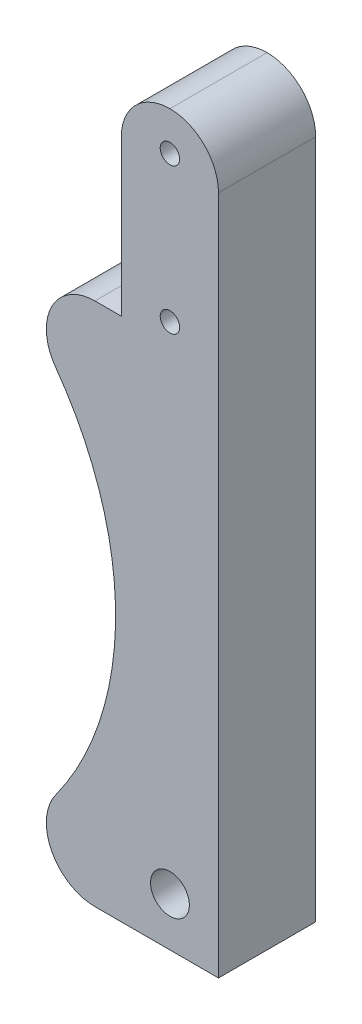
ISO-10303-21;
HEADER;
FILE_DESCRIPTION(('STEP AP214'),'2;1');
FILE_NAME('part.step','',(''),(''),'','','');
FILE_SCHEMA(('AUTOMOTIVE_DESIGN { 1 0 10303 214 1 1 1 1 }'));
ENDSEC;
DATA;
#1=APPLICATION_CONTEXT('core data for automotive mechanical design processes');
#2=APPLICATION_PROTOCOL_DEFINITION('international standard','automotive_design',2000,#1);
#3=PRODUCT_CONTEXT('',#1,'mechanical');
#4=PRODUCT('Part','Part','',(#3));
#5=PRODUCT_RELATED_PRODUCT_CATEGORY('part','',(#4));
#6=PRODUCT_DEFINITION_FORMATION('','',#4);
#7=PRODUCT_DEFINITION_CONTEXT('part definition',#1,'design');
#8=PRODUCT_DEFINITION('design','',#6,#7);
#9=PRODUCT_DEFINITION_SHAPE('','',#8);
#10=(LENGTH_UNIT() NAMED_UNIT(*) SI_UNIT(.MILLI.,.METRE.));
#11=(NAMED_UNIT(*) PLANE_ANGLE_UNIT() SI_UNIT($,.RADIAN.));
#12=(NAMED_UNIT(*) SI_UNIT($,.STERADIAN.) SOLID_ANGLE_UNIT());
#13=UNCERTAINTY_MEASURE_WITH_UNIT(LENGTH_MEASURE(1.E-05),#10,'distance_accuracy_value','');
#14=(GEOMETRIC_REPRESENTATION_CONTEXT(3) GLOBAL_UNCERTAINTY_ASSIGNED_CONTEXT((#13)) GLOBAL_UNIT_ASSIGNED_CONTEXT((#10,
#11,#12)) REPRESENTATION_CONTEXT('',''));
#15=CARTESIAN_POINT('',(0.,0.,0.));
#16=DIRECTION('',(0.,0.,1.));
#17=DIRECTION('',(1.,0.,0.));
#18=AXIS2_PLACEMENT_3D('',#15,#16,#17);
#19=CARTESIAN_POINT('',(0.,0.,10.));
#20=DIRECTION('',(1.,0.,0.));
#21=DIRECTION('',(0.,0.,-1.));
#22=AXIS2_PLACEMENT_3D('',#19,#20,#21);
#23=PLANE('',#22);
#24=DIRECTION('',(0.,-1.,0.));
#25=VECTOR('',#24,1.);
#26=CARTESIAN_POINT('',(0.,0.,0.));
#27=LINE('',#26,#25);
#28=CARTESIAN_POINT('',(0.,70.,0.));
#29=VERTEX_POINT('',#28);
#30=CARTESIAN_POINT('',(0.,54.,0.));
#31=VERTEX_POINT('',#30);
#32=EDGE_CURVE('E129',#29,#31,#27,.T.);
#33=ORIENTED_EDGE('',*,*,#32,.T.);
#34=DIRECTION('',(0.,0.,1.));
#35=VECTOR('',#34,1.);
#36=CARTESIAN_POINT('',(0.,54.,0.));
#37=LINE('',#36,#35);
#38=CARTESIAN_POINT('',(0.,54.,10.));
#39=VERTEX_POINT('',#38);
#40=EDGE_CURVE('E150',#31,#39,#37,.T.);
#41=ORIENTED_EDGE('',*,*,#40,.T.);
#42=DIRECTION('',(0.,-1.,0.));
#43=VECTOR('',#42,1.);
#44=CARTESIAN_POINT('',(0.,0.,10.));
#45=LINE('',#44,#43);
#46=CARTESIAN_POINT('',(0.,70.,10.));
#47=VERTEX_POINT('',#46);
#48=EDGE_CURVE('E111',#47,#39,#45,.T.);
#49=ORIENTED_EDGE('',*,*,#48,.F.);
#50=DIRECTION('',(0.,0.,-1.));
#51=VECTOR('',#50,1.);
#52=CARTESIAN_POINT('',(0.,70.,10.));
#53=LINE('',#52,#51);
#54=EDGE_CURVE('E143',#47,#29,#53,.T.);
#55=ORIENTED_EDGE('',*,*,#54,.T.);
#56=EDGE_LOOP('',(#33,#41,#49,#55));
#57=FACE_BOUND('',#56,.T.);
#58=ADVANCED_FACE('F33',(#57),#23,.F.);
#59=CARTESIAN_POINT('',(0.,0.,10.));
#60=DIRECTION('',(0.,1.,0.));
#61=DIRECTION('',(0.,0.,1.));
#62=AXIS2_PLACEMENT_3D('',#59,#60,#61);
#63=PLANE('',#62);
#64=DIRECTION('',(1.,0.,0.));
#65=VECTOR('',#64,1.);
#66=CARTESIAN_POINT('',(0.,0.,10.));
#67=LINE('',#66,#65);
#68=CARTESIAN_POINT('',(-2.72148323700512,0.,10.));
#69=VERTEX_POINT('',#68);
#70=CARTESIAN_POINT('',(10.,0.,10.));
#71=VERTEX_POINT('',#70);
#72=EDGE_CURVE('E103',#69,#71,#67,.T.);
#73=ORIENTED_EDGE('',*,*,#72,.F.);
#74=DIRECTION('',(0.,0.,-1.));
#75=VECTOR('',#74,1.);
#76=CARTESIAN_POINT('',(-2.72148323700512,0.,0.));
#77=LINE('',#76,#75);
#78=CARTESIAN_POINT('',(-2.72148323700512,0.,0.));
#79=VERTEX_POINT('',#78);
#80=EDGE_CURVE('E11',#69,#79,#77,.T.);
#81=ORIENTED_EDGE('',*,*,#80,.T.);
#82=DIRECTION('',(1.,0.,0.));
#83=VECTOR('',#82,1.);
#84=CARTESIAN_POINT('',(0.,0.,0.));
#85=LINE('',#84,#83);
#86=CARTESIAN_POINT('',(10.,0.,0.));
#87=VERTEX_POINT('',#86);
#88=EDGE_CURVE('E116',#79,#87,#85,.T.);
#89=ORIENTED_EDGE('',*,*,#88,.T.);
#90=DIRECTION('',(0.,0.,-1.));
#91=VECTOR('',#90,1.);
#92=CARTESIAN_POINT('',(10.,0.,10.));
#93=LINE('',#92,#91);
#94=EDGE_CURVE('E114',#71,#87,#93,.T.);
#95=ORIENTED_EDGE('',*,*,#94,.F.);
#96=EDGE_LOOP('',(#73,#81,#89,#95));
#97=FACE_BOUND('',#96,.T.);
#98=ADVANCED_FACE('F115',(#97),#63,.F.);
#99=CARTESIAN_POINT('',(10.,0.,10.));
#100=DIRECTION('',(-1.,0.,0.));
#101=DIRECTION('',(0.,0.,1.));
#102=AXIS2_PLACEMENT_3D('',#99,#100,#101);
#103=PLANE('',#102);
#104=DIRECTION('',(0.,1.,0.));
#105=VECTOR('',#104,1.);
#106=CARTESIAN_POINT('',(10.,0.,0.));
#107=LINE('',#106,#105);
#108=CARTESIAN_POINT('',(10.,70.,0.));
#109=VERTEX_POINT('',#108);
#110=EDGE_CURVE('E133',#87,#109,#107,.T.);
#111=ORIENTED_EDGE('',*,*,#110,.T.);
#112=DIRECTION('',(0.,0.,-1.));
#113=VECTOR('',#112,1.);
#114=CARTESIAN_POINT('',(10.,70.,10.));
#115=LINE('',#114,#113);
#116=CARTESIAN_POINT('',(10.,70.,10.));
#117=VERTEX_POINT('',#116);
#118=EDGE_CURVE('E125',#109,#117,#115,.F.);
#119=ORIENTED_EDGE('',*,*,#118,.T.);
#120=DIRECTION('',(0.,1.,0.));
#121=VECTOR('',#120,1.);
#122=CARTESIAN_POINT('',(10.,0.,10.));
#123=LINE('',#122,#121);
#124=EDGE_CURVE('E108',#71,#117,#123,.T.);
#125=ORIENTED_EDGE('',*,*,#124,.F.);
#126=ORIENTED_EDGE('',*,*,#94,.T.);
#127=EDGE_LOOP('',(#111,#119,#125,#126));
#128=FACE_BOUND('',#127,.T.);
#129=ADVANCED_FACE('F123',(#128),#103,.F.);
#130=CARTESIAN_POINT('',(0.,0.,10.));
#131=DIRECTION('',(0.,0.,-1.));
#132=DIRECTION('',(-1.,0.,0.));
#133=AXIS2_PLACEMENT_3D('',#130,#131,#132);
#134=PLANE('',#133);
#135=CARTESIAN_POINT('',(5.,71.,10.));
#136=DIRECTION('',(0.,0.,1.));
#137=DIRECTION('',(1.,0.,0.));
#138=AXIS2_PLACEMENT_3D('',#135,#136,#137);
#139=CIRCLE('',#138,1.);
#140=CARTESIAN_POINT('',(6.,71.,10.));
#141=VERTEX_POINT('',#140);
#142=EDGE_CURVE('E193',#141,#141,#139,.T.);
#143=ORIENTED_EDGE('',*,*,#142,.F.);
#144=EDGE_LOOP('',(#143));
#145=FACE_BOUND('',#144,.T.);
#146=CARTESIAN_POINT('',(5.,5.,10.));
#147=DIRECTION('',(0.,0.,1.));
#148=DIRECTION('',(1.,0.,0.));
#149=AXIS2_PLACEMENT_3D('',#146,#147,#148);
#150=CIRCLE('',#149,2.);
#151=CARTESIAN_POINT('',(7.,5.,10.));
#152=VERTEX_POINT('',#151);
#153=EDGE_CURVE('E149',#152,#152,#150,.T.);
#154=ORIENTED_EDGE('',*,*,#153,.F.);
#155=EDGE_LOOP('',(#154));
#156=FACE_BOUND('',#155,.T.);
#157=CARTESIAN_POINT('',(5.,56.,10.));
#158=DIRECTION('',(0.,0.,1.));
#159=DIRECTION('',(1.,0.,0.));
#160=AXIS2_PLACEMENT_3D('',#157,#158,#159);
#161=CIRCLE('',#160,1.);
#162=CARTESIAN_POINT('',(6.,56.,10.));
#163=VERTEX_POINT('',#162);
#164=EDGE_CURVE('E192',#163,#163,#161,.T.);
#165=ORIENTED_EDGE('',*,*,#164,.F.);
#166=EDGE_LOOP('',(#165));
#167=FACE_BOUND('',#166,.T.);
#168=DIRECTION('',(-1.,0.,0.));
#169=VECTOR('',#168,1.);
#170=CARTESIAN_POINT('',(0.,54.,10.));
#171=LINE('',#170,#169);
#172=CARTESIAN_POINT('',(-2.72148323700512,54.,10.));
#173=VERTEX_POINT('',#172);
#174=EDGE_CURVE('E180',#39,#173,#171,.T.);
#175=ORIENTED_EDGE('',*,*,#174,.T.);
#176=CARTESIAN_POINT('',(-2.72148323700512,49.,10.));
#177=DIRECTION('',(0.,0.,-1.));
#178=DIRECTION('',(-1.,0.,0.));
#179=AXIS2_PLACEMENT_3D('',#176,#177,#178);
#180=CIRCLE('',#179,5.);
#181=CARTESIAN_POINT('',(-6.77062580742118,46.0666666666667,10.));
#182=VERTEX_POINT('',#181);
#183=EDGE_CURVE('E154',#173,#182,#180,.F.);
#184=ORIENTED_EDGE('',*,*,#183,.T.);
#185=CARTESIAN_POINT('',(-33.0900525151255,27.,10.));
#186=DIRECTION('',(0.,0.,-1.));
#187=DIRECTION('',(-1.,0.,0.));
#188=AXIS2_PLACEMENT_3D('',#185,#186,#187);
#189=CIRCLE('',#188,32.5);
#190=CARTESIAN_POINT('',(-6.77062580742117,7.93333333333334,10.));
#191=VERTEX_POINT('',#190);
#192=EDGE_CURVE('E175',#182,#191,#189,.T.);
#193=ORIENTED_EDGE('',*,*,#192,.T.);
#194=CARTESIAN_POINT('',(-2.72148323700512,5.,10.));
#195=DIRECTION('',(0.,0.,-1.));
#196=DIRECTION('',(-1.,0.,0.));
#197=AXIS2_PLACEMENT_3D('',#194,#195,#196);
#198=CIRCLE('',#197,5.);
#199=EDGE_CURVE('E110',#191,#69,#198,.F.);
#200=ORIENTED_EDGE('',*,*,#199,.T.);
#201=ORIENTED_EDGE('',*,*,#72,.T.);
#202=ORIENTED_EDGE('',*,*,#124,.T.);
#203=CARTESIAN_POINT('',(5.,70.,10.));
#204=DIRECTION('',(0.,0.,-1.));
#205=DIRECTION('',(-1.,0.,0.));
#206=AXIS2_PLACEMENT_3D('',#203,#204,#205);
#207=CIRCLE('',#206,5.);
#208=CARTESIAN_POINT('',(5.,75.,10.));
#209=VERTEX_POINT('',#208);
#210=EDGE_CURVE('E141',#117,#209,#207,.F.);
#211=ORIENTED_EDGE('',*,*,#210,.T.);
#212=CARTESIAN_POINT('',(5.,70.,10.));
#213=DIRECTION('',(0.,0.,-1.));
#214=DIRECTION('',(-1.,0.,0.));
#215=AXIS2_PLACEMENT_3D('',#212,#213,#214);
#216=CIRCLE('',#215,5.);
#217=EDGE_CURVE('E139',#209,#47,#216,.F.);
#218=ORIENTED_EDGE('',*,*,#217,.T.);
#219=ORIENTED_EDGE('',*,*,#48,.T.);
#220=EDGE_LOOP('',(#175,#184,#193,#200,#201,#202,#211,#218,#219));
#221=FACE_BOUND('',#220,.T.);
#222=ADVANCED_FACE('F106',(#145,#156,#167,#221),#134,.F.);
#223=CARTESIAN_POINT('',(0.,0.,0.));
#224=DIRECTION('',(0.,0.,-1.));
#225=DIRECTION('',(-1.,0.,0.));
#226=AXIS2_PLACEMENT_3D('',#223,#224,#225);
#227=PLANE('',#226);
#228=CARTESIAN_POINT('',(5.,71.,0.));
#229=DIRECTION('',(0.,0.,1.));
#230=DIRECTION('',(1.,0.,0.));
#231=AXIS2_PLACEMENT_3D('',#228,#229,#230);
#232=CIRCLE('',#231,1.);
#233=CARTESIAN_POINT('',(6.,71.,0.));
#234=VERTEX_POINT('',#233);
#235=EDGE_CURVE('E189',#234,#234,#232,.T.);
#236=ORIENTED_EDGE('',*,*,#235,.T.);
#237=EDGE_LOOP('',(#236));
#238=FACE_BOUND('',#237,.T.);
#239=CARTESIAN_POINT('',(5.,5.,0.));
#240=DIRECTION('',(0.,0.,1.));
#241=DIRECTION('',(1.,0.,0.));
#242=AXIS2_PLACEMENT_3D('',#239,#240,#241);
#243=CIRCLE('',#242,2.);
#244=CARTESIAN_POINT('',(7.,5.,0.));
#245=VERTEX_POINT('',#244);
#246=EDGE_CURVE('E196',#245,#245,#243,.T.);
#247=ORIENTED_EDGE('',*,*,#246,.T.);
#248=EDGE_LOOP('',(#247));
#249=FACE_BOUND('',#248,.T.);
#250=CARTESIAN_POINT('',(5.,56.,0.));
#251=DIRECTION('',(0.,0.,1.));
#252=DIRECTION('',(1.,0.,0.));
#253=AXIS2_PLACEMENT_3D('',#250,#251,#252);
#254=CIRCLE('',#253,1.);
#255=CARTESIAN_POINT('',(6.,56.,0.));
#256=VERTEX_POINT('',#255);
#257=EDGE_CURVE('E131',#256,#256,#254,.T.);
#258=ORIENTED_EDGE('',*,*,#257,.T.);
#259=EDGE_LOOP('',(#258));
#260=FACE_BOUND('',#259,.T.);
#261=CARTESIAN_POINT('',(-33.0900525151255,27.,0.));
#262=DIRECTION('',(0.,0.,-1.));
#263=DIRECTION('',(-1.,0.,0.));
#264=AXIS2_PLACEMENT_3D('',#261,#262,#263);
#265=CIRCLE('',#264,32.5);
#266=CARTESIAN_POINT('',(-6.77062580742118,46.0666666666667,0.));
#267=VERTEX_POINT('',#266);
#268=CARTESIAN_POINT('',(-6.77062580742117,7.93333333333334,0.));
#269=VERTEX_POINT('',#268);
#270=EDGE_CURVE('E167',#267,#269,#265,.T.);
#271=ORIENTED_EDGE('',*,*,#270,.F.);
#272=CARTESIAN_POINT('',(-2.72148323700512,49.,0.));
#273=DIRECTION('',(0.,0.,-1.));
#274=DIRECTION('',(-1.,0.,0.));
#275=AXIS2_PLACEMENT_3D('',#272,#273,#274);
#276=CIRCLE('',#275,5.);
#277=CARTESIAN_POINT('',(-2.72148323700512,54.,0.));
#278=VERTEX_POINT('',#277);
#279=EDGE_CURVE('E41',#267,#278,#276,.T.);
#280=ORIENTED_EDGE('',*,*,#279,.T.);
#281=DIRECTION('',(-1.,0.,0.));
#282=VECTOR('',#281,1.);
#283=CARTESIAN_POINT('',(0.,54.,0.));
#284=LINE('',#283,#282);
#285=EDGE_CURVE('E166',#31,#278,#284,.T.);
#286=ORIENTED_EDGE('',*,*,#285,.F.);
#287=ORIENTED_EDGE('',*,*,#32,.F.);
#288=CARTESIAN_POINT('',(5.,70.,0.));
#289=DIRECTION('',(0.,0.,-1.));
#290=DIRECTION('',(-1.,0.,0.));
#291=AXIS2_PLACEMENT_3D('',#288,#289,#290);
#292=CIRCLE('',#291,5.);
#293=CARTESIAN_POINT('',(5.,75.,0.));
#294=VERTEX_POINT('',#293);
#295=EDGE_CURVE('E120',#29,#294,#292,.T.);
#296=ORIENTED_EDGE('',*,*,#295,.T.);
#297=CARTESIAN_POINT('',(5.,70.,0.));
#298=DIRECTION('',(0.,0.,-1.));
#299=DIRECTION('',(-1.,0.,0.));
#300=AXIS2_PLACEMENT_3D('',#297,#298,#299);
#301=CIRCLE('',#300,5.);
#302=EDGE_CURVE('E136',#294,#109,#301,.T.);
#303=ORIENTED_EDGE('',*,*,#302,.T.);
#304=ORIENTED_EDGE('',*,*,#110,.F.);
#305=ORIENTED_EDGE('',*,*,#88,.F.);
#306=CARTESIAN_POINT('',(-2.72148323700512,5.,0.));
#307=DIRECTION('',(0.,0.,-1.));
#308=DIRECTION('',(-1.,0.,0.));
#309=AXIS2_PLACEMENT_3D('',#306,#307,#308);
#310=CIRCLE('',#309,5.);
#311=EDGE_CURVE('E53',#79,#269,#310,.T.);
#312=ORIENTED_EDGE('',*,*,#311,.T.);
#313=EDGE_LOOP('',(#271,#280,#286,#287,#296,#303,#304,#305,#312));
#314=FACE_BOUND('',#313,.T.);
#315=ADVANCED_FACE('F164',(#238,#249,#260,#314),#227,.T.);
#316=CARTESIAN_POINT('',(5.,56.,0.));
#317=DIRECTION('',(0.,0.,1.));
#318=DIRECTION('',(1.,0.,0.));
#319=AXIS2_PLACEMENT_3D('',#316,#317,#318);
#320=CYLINDRICAL_SURFACE('',#319,1.);
#321=ORIENTED_EDGE('',*,*,#257,.F.);
#322=EDGE_LOOP('',(#321));
#323=FACE_BOUND('',#322,.T.);
#324=ORIENTED_EDGE('',*,*,#164,.T.);
#325=EDGE_LOOP('',(#324));
#326=FACE_BOUND('',#325,.T.);
#327=ADVANCED_FACE('F235',(#323,#326),#320,.F.);
#328=CARTESIAN_POINT('',(5.,5.,0.));
#329=DIRECTION('',(0.,0.,1.));
#330=DIRECTION('',(1.,0.,0.));
#331=AXIS2_PLACEMENT_3D('',#328,#329,#330);
#332=CYLINDRICAL_SURFACE('',#331,2.);
#333=ORIENTED_EDGE('',*,*,#246,.F.);
#334=EDGE_LOOP('',(#333));
#335=FACE_BOUND('',#334,.T.);
#336=ORIENTED_EDGE('',*,*,#153,.T.);
#337=EDGE_LOOP('',(#336));
#338=FACE_BOUND('',#337,.T.);
#339=ADVANCED_FACE('F242',(#335,#338),#332,.F.);
#340=CARTESIAN_POINT('',(5.,71.,0.));
#341=DIRECTION('',(0.,0.,1.));
#342=DIRECTION('',(1.,0.,0.));
#343=AXIS2_PLACEMENT_3D('',#340,#341,#342);
#344=CYLINDRICAL_SURFACE('',#343,1.);
#345=ORIENTED_EDGE('',*,*,#235,.F.);
#346=EDGE_LOOP('',(#345));
#347=FACE_BOUND('',#346,.T.);
#348=ORIENTED_EDGE('',*,*,#142,.T.);
#349=EDGE_LOOP('',(#348));
#350=FACE_BOUND('',#349,.T.);
#351=ADVANCED_FACE('F222',(#347,#350),#344,.F.);
#352=CARTESIAN_POINT('',(5.,70.,10.));
#353=DIRECTION('',(0.,0.,-1.));
#354=DIRECTION('',(-1.,0.,0.));
#355=AXIS2_PLACEMENT_3D('',#352,#353,#354);
#356=CYLINDRICAL_SURFACE('',#355,5.);
#357=ORIENTED_EDGE('',*,*,#54,.F.);
#358=ORIENTED_EDGE('',*,*,#217,.F.);
#359=DIRECTION('',(0.,0.,-1.));
#360=VECTOR('',#359,1.);
#361=CARTESIAN_POINT('',(5.,75.,10.));
#362=LINE('',#361,#360);
#363=EDGE_CURVE('E146',#294,#209,#362,.F.);
#364=ORIENTED_EDGE('',*,*,#363,.F.);
#365=ORIENTED_EDGE('',*,*,#295,.F.);
#366=EDGE_LOOP('',(#357,#358,#364,#365));
#367=FACE_BOUND('',#366,.T.);
#368=ADVANCED_FACE('F210',(#367),#356,.T.);
#369=CARTESIAN_POINT('',(5.,70.,10.));
#370=DIRECTION('',(0.,0.,-1.));
#371=DIRECTION('',(-1.,0.,0.));
#372=AXIS2_PLACEMENT_3D('',#369,#370,#371);
#373=CYLINDRICAL_SURFACE('',#372,5.);
#374=ORIENTED_EDGE('',*,*,#210,.F.);
#375=ORIENTED_EDGE('',*,*,#118,.F.);
#376=ORIENTED_EDGE('',*,*,#302,.F.);
#377=ORIENTED_EDGE('',*,*,#363,.T.);
#378=EDGE_LOOP('',(#374,#375,#376,#377));
#379=FACE_BOUND('',#378,.T.);
#380=ADVANCED_FACE('F214',(#379),#373,.T.);
#381=CARTESIAN_POINT('',(-33.0900525151255,27.,0.));
#382=DIRECTION('',(0.,0.,1.));
#383=DIRECTION('',(1.,0.,0.));
#384=AXIS2_PLACEMENT_3D('',#381,#382,#383);
#385=CYLINDRICAL_SURFACE('',#384,32.5);
#386=ORIENTED_EDGE('',*,*,#192,.F.);
#387=DIRECTION('',(0.,0.,1.));
#388=VECTOR('',#387,1.);
#389=CARTESIAN_POINT('',(-6.77062580742117,46.0666666666667,0.));
#390=LINE('',#389,#388);
#391=EDGE_CURVE('E159',#182,#267,#390,.F.);
#392=ORIENTED_EDGE('',*,*,#391,.T.);
#393=ORIENTED_EDGE('',*,*,#270,.T.);
#394=DIRECTION('',(0.,0.,1.));
#395=VECTOR('',#394,1.);
#396=CARTESIAN_POINT('',(-6.77062580742117,7.93333333333333,0.));
#397=LINE('',#396,#395);
#398=EDGE_CURVE('E156',#269,#191,#397,.T.);
#399=ORIENTED_EDGE('',*,*,#398,.T.);
#400=EDGE_LOOP('',(#386,#392,#393,#399));
#401=FACE_BOUND('',#400,.T.);
#402=ADVANCED_FACE('F182',(#401),#385,.F.);
#403=CARTESIAN_POINT('',(0.,54.,0.));
#404=DIRECTION('',(0.,1.,0.));
#405=DIRECTION('',(0.,0.,1.));
#406=AXIS2_PLACEMENT_3D('',#403,#404,#405);
#407=PLANE('',#406);
#408=ORIENTED_EDGE('',*,*,#285,.T.);
#409=DIRECTION('',(0.,0.,1.));
#410=VECTOR('',#409,1.);
#411=CARTESIAN_POINT('',(-2.72148323700512,54.,0.));
#412=LINE('',#411,#410);
#413=EDGE_CURVE('E145',#278,#173,#412,.T.);
#414=ORIENTED_EDGE('',*,*,#413,.T.);
#415=ORIENTED_EDGE('',*,*,#174,.F.);
#416=ORIENTED_EDGE('',*,*,#40,.F.);
#417=EDGE_LOOP('',(#408,#414,#415,#416));
#418=FACE_BOUND('',#417,.T.);
#419=ADVANCED_FACE('F173',(#418),#407,.T.);
#420=CARTESIAN_POINT('',(-2.72148323700512,49.,0.));
#421=DIRECTION('',(0.,0.,1.));
#422=DIRECTION('',(1.,0.,0.));
#423=AXIS2_PLACEMENT_3D('',#420,#421,#422);
#424=CYLINDRICAL_SURFACE('',#423,5.);
#425=ORIENTED_EDGE('',*,*,#279,.F.);
#426=ORIENTED_EDGE('',*,*,#391,.F.);
#427=ORIENTED_EDGE('',*,*,#183,.F.);
#428=ORIENTED_EDGE('',*,*,#413,.F.);
#429=EDGE_LOOP('',(#425,#426,#427,#428));
#430=FACE_BOUND('',#429,.T.);
#431=ADVANCED_FACE('F177',(#430),#424,.T.);
#432=CARTESIAN_POINT('',(-2.72148323700512,5.,0.));
#433=DIRECTION('',(0.,0.,1.));
#434=DIRECTION('',(1.,0.,0.));
#435=AXIS2_PLACEMENT_3D('',#432,#433,#434);
#436=CYLINDRICAL_SURFACE('',#435,5.);
#437=ORIENTED_EDGE('',*,*,#311,.F.);
#438=ORIENTED_EDGE('',*,*,#80,.F.);
#439=ORIENTED_EDGE('',*,*,#199,.F.);
#440=ORIENTED_EDGE('',*,*,#398,.F.);
#441=EDGE_LOOP('',(#437,#438,#439,#440));
#442=FACE_BOUND('',#441,.T.);
#443=ADVANCED_FACE('F35',(#442),#436,.T.);
#444=CLOSED_SHELL('',(#58,#98,#129,#222,#315,#327,#339,#351,#368,#380,#402,#419,#431,#443));
#445=MANIFOLD_SOLID_BREP('B2',#444);
#446=ADVANCED_BREP_SHAPE_REPRESENTATION('',(#18,#445),#14);
#447=SHAPE_DEFINITION_REPRESENTATION(#9,#446);
ENDSEC;
END-ISO-10303-21;
